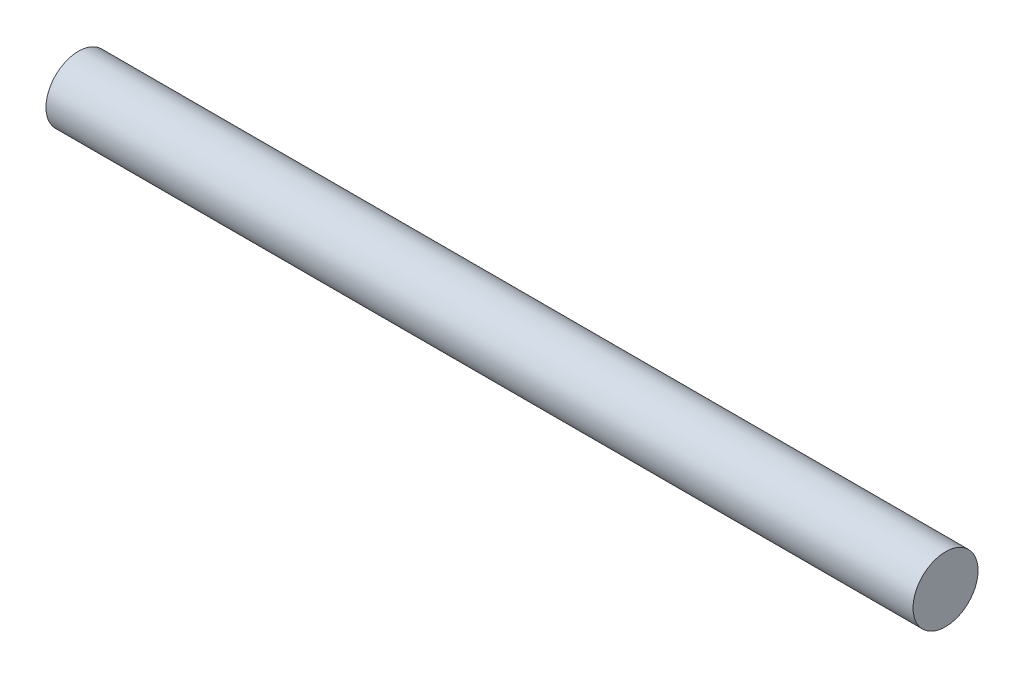
ISO-10303-21;
HEADER;
FILE_DESCRIPTION(('STEP AP214'),'2;1');
FILE_NAME('part.step','',(''),(''),'','','');
FILE_SCHEMA(('AUTOMOTIVE_DESIGN { 1 0 10303 214 1 1 1 1 }'));
ENDSEC;
DATA;
#1=APPLICATION_CONTEXT('core data for automotive mechanical design processes');
#2=APPLICATION_PROTOCOL_DEFINITION('international standard','automotive_design',2000,#1);
#3=PRODUCT_CONTEXT('',#1,'mechanical');
#4=PRODUCT('Part','Part','',(#3));
#5=PRODUCT_RELATED_PRODUCT_CATEGORY('part','',(#4));
#6=PRODUCT_DEFINITION_FORMATION('','',#4);
#7=PRODUCT_DEFINITION_CONTEXT('part definition',#1,'design');
#8=PRODUCT_DEFINITION('design','',#6,#7);
#9=PRODUCT_DEFINITION_SHAPE('','',#8);
#10=(LENGTH_UNIT() NAMED_UNIT(*) SI_UNIT(.MILLI.,.METRE.));
#11=(NAMED_UNIT(*) PLANE_ANGLE_UNIT() SI_UNIT($,.RADIAN.));
#12=(NAMED_UNIT(*) SI_UNIT($,.STERADIAN.) SOLID_ANGLE_UNIT());
#13=UNCERTAINTY_MEASURE_WITH_UNIT(LENGTH_MEASURE(1.E-05),#10,'distance_accuracy_value','');
#14=(GEOMETRIC_REPRESENTATION_CONTEXT(3) GLOBAL_UNCERTAINTY_ASSIGNED_CONTEXT((#13)) GLOBAL_UNIT_ASSIGNED_CONTEXT((#10,
#11,#12)) REPRESENTATION_CONTEXT('',''));
#15=CARTESIAN_POINT('',(0.,0.,0.));
#16=DIRECTION('',(0.,0.,1.));
#17=DIRECTION('',(1.,0.,0.));
#18=AXIS2_PLACEMENT_3D('',#15,#16,#17);
#19=CARTESIAN_POINT('',(0.,0.,0.));
#20=DIRECTION('',(1.,0.,0.));
#21=DIRECTION('',(0.,0.,-1.));
#22=AXIS2_PLACEMENT_3D('',#19,#20,#21);
#23=PLANE('',#22);
#24=CARTESIAN_POINT('',(0.,0.,0.));
#25=DIRECTION('',(-1.,0.,0.));
#26=DIRECTION('',(0.,0.,1.));
#27=AXIS2_PLACEMENT_3D('',#24,#25,#26);
#28=CIRCLE('',#27,1.5);
#29=CARTESIAN_POINT('',(0.,0.,1.5));
#30=VERTEX_POINT('',#29);
#31=EDGE_CURVE('E10',#30,#30,#28,.T.);
#32=ORIENTED_EDGE('',*,*,#31,.T.);
#33=EDGE_LOOP('',(#32));
#34=FACE_BOUND('',#33,.T.);
#35=ADVANCED_FACE('F31',(#34),#23,.F.);
#36=CARTESIAN_POINT('',(0.,0.,0.));
#37=DIRECTION('',(-1.,0.,0.));
#38=DIRECTION('',(0.,0.,1.));
#39=AXIS2_PLACEMENT_3D('',#36,#37,#38);
#40=CYLINDRICAL_SURFACE('',#39,1.5);
#41=ORIENTED_EDGE('',*,*,#31,.F.);
#42=EDGE_LOOP('',(#41));
#43=FACE_BOUND('',#42,.T.);
#44=CARTESIAN_POINT('',(40.,0.,0.));
#45=DIRECTION('',(-1.,0.,0.));
#46=DIRECTION('',(0.,0.,1.));
#47=AXIS2_PLACEMENT_3D('',#44,#45,#46);
#48=CIRCLE('',#47,1.5);
#49=CARTESIAN_POINT('',(40.,0.,1.5));
#50=VERTEX_POINT('',#49);
#51=EDGE_CURVE('E37',#50,#50,#48,.T.);
#52=ORIENTED_EDGE('',*,*,#51,.T.);
#53=EDGE_LOOP('',(#52));
#54=FACE_BOUND('',#53,.T.);
#55=ADVANCED_FACE('F43',(#43,#54),#40,.T.);
#56=CARTESIAN_POINT('',(40.,0.,0.));
#57=DIRECTION('',(-1.,0.,0.));
#58=DIRECTION('',(0.,0.,1.));
#59=AXIS2_PLACEMENT_3D('',#56,#57,#58);
#60=PLANE('',#59);
#61=ORIENTED_EDGE('',*,*,#51,.F.);
#62=EDGE_LOOP('',(#61));
#63=FACE_BOUND('',#62,.T.);
#64=ADVANCED_FACE('F45',(#63),#60,.F.);
#65=CLOSED_SHELL('',(#35,#55,#64));
#66=MANIFOLD_SOLID_BREP('B2',#65);
#67=ADVANCED_BREP_SHAPE_REPRESENTATION('',(#18,#66),#14);
#68=SHAPE_DEFINITION_REPRESENTATION(#9,#67);
ENDSEC;
END-ISO-10303-21;
